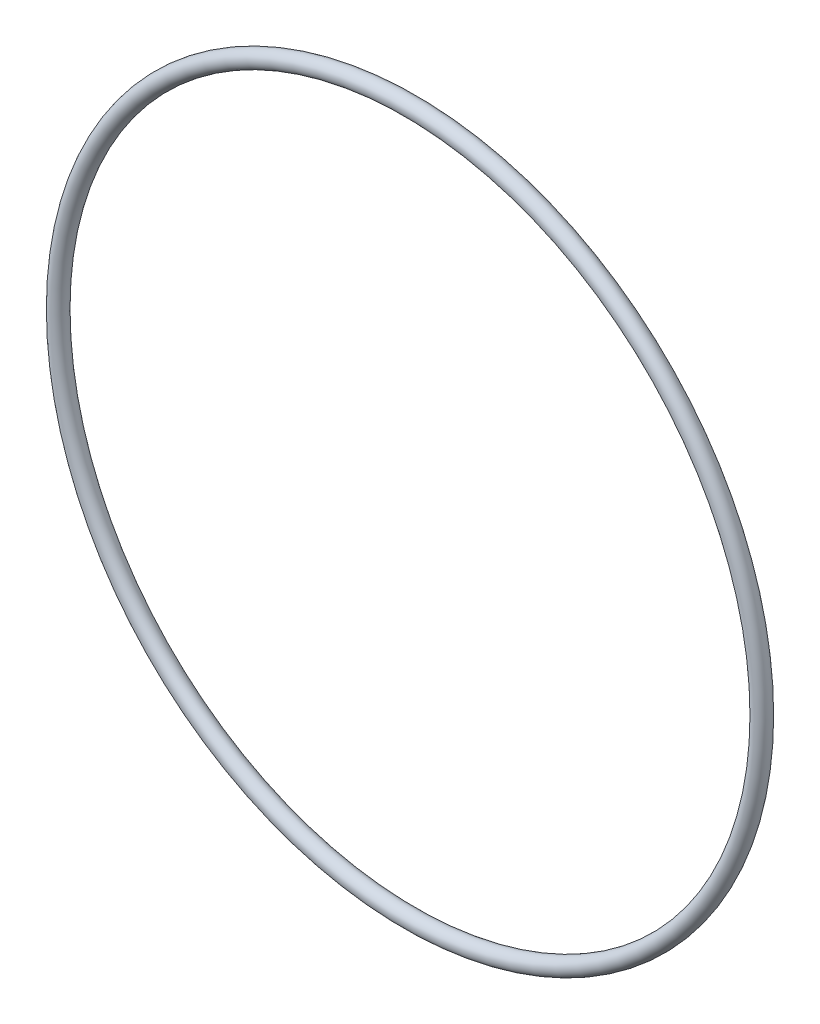
ISO-10303-21;
HEADER;
FILE_DESCRIPTION(('STEP AP214'),'2;1');
FILE_NAME('part.step','',(''),(''),'','','');
FILE_SCHEMA(('AUTOMOTIVE_DESIGN { 1 0 10303 214 1 1 1 1 }'));
ENDSEC;
DATA;
#1=APPLICATION_CONTEXT('core data for automotive mechanical design processes');
#2=APPLICATION_PROTOCOL_DEFINITION('international standard','automotive_design',2000,#1);
#3=PRODUCT_CONTEXT('',#1,'mechanical');
#4=PRODUCT('Part','Part','',(#3));
#5=PRODUCT_RELATED_PRODUCT_CATEGORY('part','',(#4));
#6=PRODUCT_DEFINITION_FORMATION('','',#4);
#7=PRODUCT_DEFINITION_CONTEXT('part definition',#1,'design');
#8=PRODUCT_DEFINITION('design','',#6,#7);
#9=PRODUCT_DEFINITION_SHAPE('','',#8);
#10=(LENGTH_UNIT() NAMED_UNIT(*) SI_UNIT(.MILLI.,.METRE.));
#11=(NAMED_UNIT(*) PLANE_ANGLE_UNIT() SI_UNIT($,.RADIAN.));
#12=(NAMED_UNIT(*) SI_UNIT($,.STERADIAN.) SOLID_ANGLE_UNIT());
#13=UNCERTAINTY_MEASURE_WITH_UNIT(LENGTH_MEASURE(1.E-05),#10,'distance_accuracy_value','');
#14=(GEOMETRIC_REPRESENTATION_CONTEXT(3) GLOBAL_UNCERTAINTY_ASSIGNED_CONTEXT((#13)) GLOBAL_UNIT_ASSIGNED_CONTEXT((#10,
#11,#12)) REPRESENTATION_CONTEXT('',''));
#15=CARTESIAN_POINT('',(0.,0.,0.));
#16=DIRECTION('',(0.,0.,1.));
#17=DIRECTION('',(1.,0.,0.));
#18=AXIS2_PLACEMENT_3D('',#15,#16,#17);
#19=CARTESIAN_POINT('',(0.,0.,0.));
#20=DIRECTION('',(0.,0.,1.));
#21=DIRECTION('',(1.,0.,0.));
#22=AXIS2_PLACEMENT_3D('',#19,#20,#21);
#23=TOROIDAL_SURFACE('',#22,52.5,1.25);
#24=CARTESIAN_POINT('',(53.75,0.,0.));
#25=VERTEX_POINT('',#24);
#26=VERTEX_LOOP('',#25);
#27=FACE_BOUND('',#26,.T.);
#28=ADVANCED_FACE('F35',(#27),#23,.T.);
#29=CLOSED_SHELL('',(#28));
#30=MANIFOLD_SOLID_BREP('B2',#29);
#31=ADVANCED_BREP_SHAPE_REPRESENTATION('',(#18,#30),#14);
#32=SHAPE_DEFINITION_REPRESENTATION(#9,#31);
ENDSEC;
END-ISO-10303-21;
